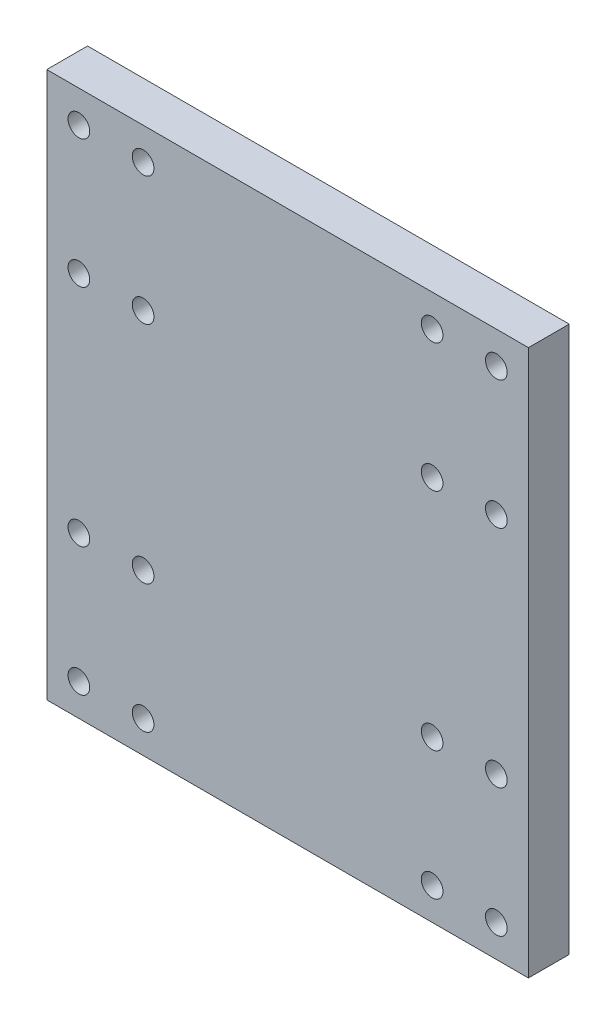
ISO-10303-21;
HEADER;
FILE_DESCRIPTION(('STEP AP214'),'2;1');
FILE_NAME('part.step','',(''),(''),'','','');
FILE_SCHEMA(('AUTOMOTIVE_DESIGN { 1 0 10303 214 1 1 1 1 }'));
ENDSEC;
DATA;
#1=APPLICATION_CONTEXT('core data for automotive mechanical design processes');
#2=APPLICATION_PROTOCOL_DEFINITION('international standard','automotive_design',2000,#1);
#3=PRODUCT_CONTEXT('',#1,'mechanical');
#4=PRODUCT('Part','Part','',(#3));
#5=PRODUCT_RELATED_PRODUCT_CATEGORY('part','',(#4));
#6=PRODUCT_DEFINITION_FORMATION('','',#4);
#7=PRODUCT_DEFINITION_CONTEXT('part definition',#1,'design');
#8=PRODUCT_DEFINITION('design','',#6,#7);
#9=PRODUCT_DEFINITION_SHAPE('','',#8);
#10=(LENGTH_UNIT() NAMED_UNIT(*) SI_UNIT(.MILLI.,.METRE.));
#11=(NAMED_UNIT(*) PLANE_ANGLE_UNIT() SI_UNIT($,.RADIAN.));
#12=(NAMED_UNIT(*) SI_UNIT($,.STERADIAN.) SOLID_ANGLE_UNIT());
#13=UNCERTAINTY_MEASURE_WITH_UNIT(LENGTH_MEASURE(1.E-05),#10,'distance_accuracy_value','');
#14=(GEOMETRIC_REPRESENTATION_CONTEXT(3) GLOBAL_UNCERTAINTY_ASSIGNED_CONTEXT((#13)) GLOBAL_UNIT_ASSIGNED_CONTEXT((#10,
#11,#12)) REPRESENTATION_CONTEXT('',''));
#15=CARTESIAN_POINT('',(0.,0.,0.));
#16=DIRECTION('',(0.,0.,1.));
#17=DIRECTION('',(1.,0.,0.));
#18=AXIS2_PLACEMENT_3D('',#15,#16,#17);
#19=CARTESIAN_POINT('',(-75.,85.,6.35));
#20=DIRECTION('',(1.,0.,0.));
#21=DIRECTION('',(0.,1.,0.));
#22=AXIS2_PLACEMENT_3D('',#19,#20,#21);
#23=PLANE('',#22);
#24=DIRECTION('',(0.,-1.,0.));
#25=VECTOR('',#24,1.);
#26=CARTESIAN_POINT('',(-75.,85.,-6.35));
#27=LINE('',#26,#25);
#28=CARTESIAN_POINT('',(-75.,85.,-6.35));
#29=VERTEX_POINT('',#28);
#30=CARTESIAN_POINT('',(-75.,-85.,-6.35));
#31=VERTEX_POINT('',#30);
#32=EDGE_CURVE('E95',#29,#31,#27,.T.);
#33=ORIENTED_EDGE('',*,*,#32,.T.);
#34=DIRECTION('',(0.,0.,-1.));
#35=VECTOR('',#34,1.);
#36=CARTESIAN_POINT('',(-75.,-85.,6.35));
#37=LINE('',#36,#35);
#38=CARTESIAN_POINT('',(-75.,-85.,6.35));
#39=VERTEX_POINT('',#38);
#40=EDGE_CURVE('E11',#39,#31,#37,.T.);
#41=ORIENTED_EDGE('',*,*,#40,.F.);
#42=DIRECTION('',(0.,-1.,0.));
#43=VECTOR('',#42,1.);
#44=CARTESIAN_POINT('',(-75.,85.,6.35));
#45=LINE('',#44,#43);
#46=CARTESIAN_POINT('',(-75.,85.,6.35));
#47=VERTEX_POINT('',#46);
#48=EDGE_CURVE('E83',#47,#39,#45,.T.);
#49=ORIENTED_EDGE('',*,*,#48,.F.);
#50=DIRECTION('',(0.,0.,-1.));
#51=VECTOR('',#50,1.);
#52=CARTESIAN_POINT('',(-75.,85.,6.35));
#53=LINE('',#52,#51);
#54=EDGE_CURVE('E91',#47,#29,#53,.T.);
#55=ORIENTED_EDGE('',*,*,#54,.T.);
#56=EDGE_LOOP('',(#33,#41,#49,#55));
#57=FACE_BOUND('',#56,.T.);
#58=ADVANCED_FACE('F32',(#57),#23,.F.);
#59=CARTESIAN_POINT('',(75.,-85.,6.35));
#60=DIRECTION('',(0.,1.,0.));
#61=DIRECTION('',(-1.,0.,0.));
#62=AXIS2_PLACEMENT_3D('',#59,#60,#61);
#63=PLANE('',#62);
#64=DIRECTION('',(1.,0.,0.));
#65=VECTOR('',#64,1.);
#66=CARTESIAN_POINT('',(75.,-85.,-6.35));
#67=LINE('',#66,#65);
#68=CARTESIAN_POINT('',(75.,-85.,-6.35));
#69=VERTEX_POINT('',#68);
#70=EDGE_CURVE('E87',#31,#69,#67,.T.);
#71=ORIENTED_EDGE('',*,*,#70,.T.);
#72=DIRECTION('',(0.,0.,-1.));
#73=VECTOR('',#72,1.);
#74=CARTESIAN_POINT('',(75.,-85.,6.35));
#75=LINE('',#74,#73);
#76=CARTESIAN_POINT('',(75.,-85.,6.35));
#77=VERTEX_POINT('',#76);
#78=EDGE_CURVE('E40',#77,#69,#75,.T.);
#79=ORIENTED_EDGE('',*,*,#78,.F.);
#80=DIRECTION('',(1.,0.,0.));
#81=VECTOR('',#80,1.);
#82=CARTESIAN_POINT('',(75.,-85.,6.35));
#83=LINE('',#82,#81);
#84=EDGE_CURVE('E78',#39,#77,#83,.T.);
#85=ORIENTED_EDGE('',*,*,#84,.F.);
#86=ORIENTED_EDGE('',*,*,#40,.T.);
#87=EDGE_LOOP('',(#71,#79,#85,#86));
#88=FACE_BOUND('',#87,.T.);
#89=ADVANCED_FACE('F86',(#88),#63,.F.);
#90=CARTESIAN_POINT('',(75.,85.,6.35));
#91=DIRECTION('',(-1.,0.,0.));
#92=DIRECTION('',(0.,-1.,0.));
#93=AXIS2_PLACEMENT_3D('',#90,#91,#92);
#94=PLANE('',#93);
#95=DIRECTION('',(0.,1.,0.));
#96=VECTOR('',#95,1.);
#97=CARTESIAN_POINT('',(75.,85.,-6.35));
#98=LINE('',#97,#96);
#99=CARTESIAN_POINT('',(75.,85.,-6.35));
#100=VERTEX_POINT('',#99);
#101=EDGE_CURVE('E65',#69,#100,#98,.T.);
#102=ORIENTED_EDGE('',*,*,#101,.T.);
#103=DIRECTION('',(0.,0.,-1.));
#104=VECTOR('',#103,1.);
#105=CARTESIAN_POINT('',(75.,85.,6.35));
#106=LINE('',#105,#104);
#107=CARTESIAN_POINT('',(75.,85.,6.35));
#108=VERTEX_POINT('',#107);
#109=EDGE_CURVE('E88',#108,#100,#106,.T.);
#110=ORIENTED_EDGE('',*,*,#109,.F.);
#111=DIRECTION('',(0.,1.,0.));
#112=VECTOR('',#111,1.);
#113=CARTESIAN_POINT('',(75.,85.,6.35));
#114=LINE('',#113,#112);
#115=EDGE_CURVE('E81',#77,#108,#114,.T.);
#116=ORIENTED_EDGE('',*,*,#115,.F.);
#117=ORIENTED_EDGE('',*,*,#78,.T.);
#118=EDGE_LOOP('',(#102,#110,#116,#117));
#119=FACE_BOUND('',#118,.T.);
#120=ADVANCED_FACE('F89',(#119),#94,.F.);
#121=CARTESIAN_POINT('',(75.,85.,6.35));
#122=DIRECTION('',(0.,-1.,0.));
#123=DIRECTION('',(0.,0.,-1.));
#124=AXIS2_PLACEMENT_3D('',#121,#122,#123);
#125=PLANE('',#124);
#126=DIRECTION('',(-1.,0.,0.));
#127=VECTOR('',#126,1.);
#128=CARTESIAN_POINT('',(75.,85.,-6.35));
#129=LINE('',#128,#127);
#130=EDGE_CURVE('E71',#100,#29,#129,.T.);
#131=ORIENTED_EDGE('',*,*,#130,.T.);
#132=ORIENTED_EDGE('',*,*,#54,.F.);
#133=DIRECTION('',(-1.,0.,0.));
#134=VECTOR('',#133,1.);
#135=CARTESIAN_POINT('',(75.,85.,6.35));
#136=LINE('',#135,#134);
#137=EDGE_CURVE('E48',#108,#47,#136,.T.);
#138=ORIENTED_EDGE('',*,*,#137,.F.);
#139=ORIENTED_EDGE('',*,*,#109,.T.);
#140=EDGE_LOOP('',(#131,#132,#138,#139));
#141=FACE_BOUND('',#140,.T.);
#142=ADVANCED_FACE('F103',(#141),#125,.F.);
#143=CARTESIAN_POINT('',(0.,0.,6.35));
#144=DIRECTION('',(0.,0.,-1.));
#145=DIRECTION('',(-1.,0.,0.));
#146=AXIS2_PLACEMENT_3D('',#143,#144,#145);
#147=PLANE('',#146);
#148=CARTESIAN_POINT('',(65.,75.,6.35));
#149=DIRECTION('',(0.,0.,1.));
#150=DIRECTION('',(1.,0.,0.));
#151=AXIS2_PLACEMENT_3D('',#148,#149,#150);
#152=CIRCLE('',#151,3.37819999999998);
#153=CARTESIAN_POINT('',(68.3782,75.,6.35));
#154=VERTEX_POINT('',#153);
#155=EDGE_CURVE('E201',#154,#154,#152,.T.);
#156=ORIENTED_EDGE('',*,*,#155,.F.);
#157=EDGE_LOOP('',(#156));
#158=FACE_BOUND('',#157,.T.);
#159=CARTESIAN_POINT('',(65.,35.,6.35));
#160=DIRECTION('',(0.,0.,1.));
#161=DIRECTION('',(1.,0.,0.));
#162=AXIS2_PLACEMENT_3D('',#159,#160,#161);
#163=CIRCLE('',#162,3.37819999999998);
#164=CARTESIAN_POINT('',(68.3782,35.,6.35));
#165=VERTEX_POINT('',#164);
#166=EDGE_CURVE('E195',#165,#165,#163,.T.);
#167=ORIENTED_EDGE('',*,*,#166,.F.);
#168=EDGE_LOOP('',(#167));
#169=FACE_BOUND('',#168,.T.);
#170=CARTESIAN_POINT('',(45.,35.,6.35));
#171=DIRECTION('',(0.,0.,1.));
#172=DIRECTION('',(1.,0.,0.));
#173=AXIS2_PLACEMENT_3D('',#170,#171,#172);
#174=CIRCLE('',#173,3.37819999999998);
#175=CARTESIAN_POINT('',(48.3782,35.,6.35));
#176=VERTEX_POINT('',#175);
#177=EDGE_CURVE('E189',#176,#176,#174,.T.);
#178=ORIENTED_EDGE('',*,*,#177,.F.);
#179=EDGE_LOOP('',(#178));
#180=FACE_BOUND('',#179,.T.);
#181=CARTESIAN_POINT('',(45.,75.,6.35));
#182=DIRECTION('',(0.,0.,1.));
#183=DIRECTION('',(1.,0.,0.));
#184=AXIS2_PLACEMENT_3D('',#181,#182,#183);
#185=CIRCLE('',#184,3.37819999999998);
#186=CARTESIAN_POINT('',(48.3782,75.,6.35));
#187=VERTEX_POINT('',#186);
#188=EDGE_CURVE('E183',#187,#187,#185,.T.);
#189=ORIENTED_EDGE('',*,*,#188,.F.);
#190=EDGE_LOOP('',(#189));
#191=FACE_BOUND('',#190,.T.);
#192=CARTESIAN_POINT('',(45.,-75.,6.35));
#193=DIRECTION('',(0.,0.,1.));
#194=DIRECTION('',(1.,0.,0.));
#195=AXIS2_PLACEMENT_3D('',#192,#193,#194);
#196=CIRCLE('',#195,3.37819999999998);
#197=CARTESIAN_POINT('',(48.3782,-75.,6.35));
#198=VERTEX_POINT('',#197);
#199=EDGE_CURVE('E177',#198,#198,#196,.T.);
#200=ORIENTED_EDGE('',*,*,#199,.F.);
#201=EDGE_LOOP('',(#200));
#202=FACE_BOUND('',#201,.T.);
#203=CARTESIAN_POINT('',(45.,-35.,6.35));
#204=DIRECTION('',(0.,0.,1.));
#205=DIRECTION('',(1.,0.,0.));
#206=AXIS2_PLACEMENT_3D('',#203,#204,#205);
#207=CIRCLE('',#206,3.37819999999998);
#208=CARTESIAN_POINT('',(48.3782,-35.,6.35));
#209=VERTEX_POINT('',#208);
#210=EDGE_CURVE('E171',#209,#209,#207,.T.);
#211=ORIENTED_EDGE('',*,*,#210,.F.);
#212=EDGE_LOOP('',(#211));
#213=FACE_BOUND('',#212,.T.);
#214=CARTESIAN_POINT('',(65.,-35.,6.35));
#215=DIRECTION('',(0.,0.,1.));
#216=DIRECTION('',(1.,0.,0.));
#217=AXIS2_PLACEMENT_3D('',#214,#215,#216);
#218=CIRCLE('',#217,3.37819999999998);
#219=CARTESIAN_POINT('',(68.3782,-35.,6.35));
#220=VERTEX_POINT('',#219);
#221=EDGE_CURVE('E165',#220,#220,#218,.T.);
#222=ORIENTED_EDGE('',*,*,#221,.F.);
#223=EDGE_LOOP('',(#222));
#224=FACE_BOUND('',#223,.T.);
#225=CARTESIAN_POINT('',(65.,-75.,6.35));
#226=DIRECTION('',(0.,0.,1.));
#227=DIRECTION('',(1.,0.,0.));
#228=AXIS2_PLACEMENT_3D('',#225,#226,#227);
#229=CIRCLE('',#228,3.37819999999998);
#230=CARTESIAN_POINT('',(68.3782,-75.,6.35));
#231=VERTEX_POINT('',#230);
#232=EDGE_CURVE('E159',#231,#231,#229,.T.);
#233=ORIENTED_EDGE('',*,*,#232,.F.);
#234=EDGE_LOOP('',(#233));
#235=FACE_BOUND('',#234,.T.);
#236=CARTESIAN_POINT('',(-65.,-75.,6.35));
#237=DIRECTION('',(0.,0.,1.));
#238=DIRECTION('',(1.,0.,0.));
#239=AXIS2_PLACEMENT_3D('',#236,#237,#238);
#240=CIRCLE('',#239,3.37819999999998);
#241=CARTESIAN_POINT('',(-61.6218,-75.,6.35));
#242=VERTEX_POINT('',#241);
#243=EDGE_CURVE('E153',#242,#242,#240,.T.);
#244=ORIENTED_EDGE('',*,*,#243,.F.);
#245=EDGE_LOOP('',(#244));
#246=FACE_BOUND('',#245,.T.);
#247=CARTESIAN_POINT('',(-65.,-35.,6.35));
#248=DIRECTION('',(0.,0.,1.));
#249=DIRECTION('',(1.,0.,0.));
#250=AXIS2_PLACEMENT_3D('',#247,#248,#249);
#251=CIRCLE('',#250,3.37819999999998);
#252=CARTESIAN_POINT('',(-61.6218,-35.,6.35));
#253=VERTEX_POINT('',#252);
#254=EDGE_CURVE('E147',#253,#253,#251,.T.);
#255=ORIENTED_EDGE('',*,*,#254,.F.);
#256=EDGE_LOOP('',(#255));
#257=FACE_BOUND('',#256,.T.);
#258=CARTESIAN_POINT('',(-45.,-35.,6.35));
#259=DIRECTION('',(0.,0.,1.));
#260=DIRECTION('',(1.,0.,0.));
#261=AXIS2_PLACEMENT_3D('',#258,#259,#260);
#262=CIRCLE('',#261,3.37819999999998);
#263=CARTESIAN_POINT('',(-41.6218,-35.,6.35));
#264=VERTEX_POINT('',#263);
#265=EDGE_CURVE('E141',#264,#264,#262,.T.);
#266=ORIENTED_EDGE('',*,*,#265,.F.);
#267=EDGE_LOOP('',(#266));
#268=FACE_BOUND('',#267,.T.);
#269=CARTESIAN_POINT('',(-45.,-75.,6.35));
#270=DIRECTION('',(0.,0.,1.));
#271=DIRECTION('',(1.,0.,0.));
#272=AXIS2_PLACEMENT_3D('',#269,#270,#271);
#273=CIRCLE('',#272,3.37819999999998);
#274=CARTESIAN_POINT('',(-41.6218,-75.,6.35));
#275=VERTEX_POINT('',#274);
#276=EDGE_CURVE('E135',#275,#275,#273,.T.);
#277=ORIENTED_EDGE('',*,*,#276,.F.);
#278=EDGE_LOOP('',(#277));
#279=FACE_BOUND('',#278,.T.);
#280=CARTESIAN_POINT('',(-45.,75.,6.35));
#281=DIRECTION('',(0.,0.,1.));
#282=DIRECTION('',(1.,0.,0.));
#283=AXIS2_PLACEMENT_3D('',#280,#281,#282);
#284=CIRCLE('',#283,3.37819999999998);
#285=CARTESIAN_POINT('',(-41.6218,75.,6.35));
#286=VERTEX_POINT('',#285);
#287=EDGE_CURVE('E129',#286,#286,#284,.T.);
#288=ORIENTED_EDGE('',*,*,#287,.F.);
#289=EDGE_LOOP('',(#288));
#290=FACE_BOUND('',#289,.T.);
#291=CARTESIAN_POINT('',(-45.,35.,6.35));
#292=DIRECTION('',(0.,0.,1.));
#293=DIRECTION('',(1.,0.,0.));
#294=AXIS2_PLACEMENT_3D('',#291,#292,#293);
#295=CIRCLE('',#294,3.37819999999998);
#296=CARTESIAN_POINT('',(-41.6218,35.,6.35));
#297=VERTEX_POINT('',#296);
#298=EDGE_CURVE('E123',#297,#297,#295,.T.);
#299=ORIENTED_EDGE('',*,*,#298,.F.);
#300=EDGE_LOOP('',(#299));
#301=FACE_BOUND('',#300,.T.);
#302=CARTESIAN_POINT('',(-65.,35.,6.35));
#303=DIRECTION('',(0.,0.,1.));
#304=DIRECTION('',(1.,0.,0.));
#305=AXIS2_PLACEMENT_3D('',#302,#303,#304);
#306=CIRCLE('',#305,3.37819999999998);
#307=CARTESIAN_POINT('',(-61.6218,35.,6.35));
#308=VERTEX_POINT('',#307);
#309=EDGE_CURVE('E117',#308,#308,#306,.T.);
#310=ORIENTED_EDGE('',*,*,#309,.F.);
#311=EDGE_LOOP('',(#310));
#312=FACE_BOUND('',#311,.T.);
#313=CARTESIAN_POINT('',(-65.,75.,6.35));
#314=DIRECTION('',(0.,0.,1.));
#315=DIRECTION('',(1.,0.,0.));
#316=AXIS2_PLACEMENT_3D('',#313,#314,#315);
#317=CIRCLE('',#316,3.37819999999998);
#318=CARTESIAN_POINT('',(-61.6218,75.,6.35));
#319=VERTEX_POINT('',#318);
#320=EDGE_CURVE('E111',#319,#319,#317,.T.);
#321=ORIENTED_EDGE('',*,*,#320,.F.);
#322=EDGE_LOOP('',(#321));
#323=FACE_BOUND('',#322,.T.);
#324=ORIENTED_EDGE('',*,*,#48,.T.);
#325=ORIENTED_EDGE('',*,*,#84,.T.);
#326=ORIENTED_EDGE('',*,*,#115,.T.);
#327=ORIENTED_EDGE('',*,*,#137,.T.);
#328=EDGE_LOOP('',(#324,#325,#326,#327));
#329=FACE_BOUND('',#328,.T.);
#330=ADVANCED_FACE('F79',(#158,#169,#180,#191,#202,#213,#224,#235,#246,#257,#268,#279,#290,#301,
#312,#323,#329),#147,.F.);
#331=CARTESIAN_POINT('',(0.,0.,-6.35));
#332=DIRECTION('',(0.,0.,-1.));
#333=DIRECTION('',(-1.,0.,0.));
#334=AXIS2_PLACEMENT_3D('',#331,#332,#333);
#335=PLANE('',#334);
#336=CARTESIAN_POINT('',(65.,75.,-6.35));
#337=DIRECTION('',(0.,0.,1.));
#338=DIRECTION('',(1.,0.,0.));
#339=AXIS2_PLACEMENT_3D('',#336,#337,#338);
#340=CIRCLE('',#339,3.3782);
#341=CARTESIAN_POINT('',(68.3782,75.,-6.35));
#342=VERTEX_POINT('',#341);
#343=EDGE_CURVE('E198',#342,#342,#340,.T.);
#344=ORIENTED_EDGE('',*,*,#343,.T.);
#345=EDGE_LOOP('',(#344));
#346=FACE_BOUND('',#345,.T.);
#347=CARTESIAN_POINT('',(65.,35.,-6.35));
#348=DIRECTION('',(0.,0.,1.));
#349=DIRECTION('',(1.,0.,0.));
#350=AXIS2_PLACEMENT_3D('',#347,#348,#349);
#351=CIRCLE('',#350,3.3782);
#352=CARTESIAN_POINT('',(68.3782,35.,-6.35));
#353=VERTEX_POINT('',#352);
#354=EDGE_CURVE('E192',#353,#353,#351,.T.);
#355=ORIENTED_EDGE('',*,*,#354,.T.);
#356=EDGE_LOOP('',(#355));
#357=FACE_BOUND('',#356,.T.);
#358=CARTESIAN_POINT('',(45.,35.,-6.35));
#359=DIRECTION('',(0.,0.,1.));
#360=DIRECTION('',(1.,0.,0.));
#361=AXIS2_PLACEMENT_3D('',#358,#359,#360);
#362=CIRCLE('',#361,3.3782);
#363=CARTESIAN_POINT('',(48.3782,35.,-6.35));
#364=VERTEX_POINT('',#363);
#365=EDGE_CURVE('E186',#364,#364,#362,.T.);
#366=ORIENTED_EDGE('',*,*,#365,.T.);
#367=EDGE_LOOP('',(#366));
#368=FACE_BOUND('',#367,.T.);
#369=CARTESIAN_POINT('',(45.,75.,-6.35));
#370=DIRECTION('',(0.,0.,1.));
#371=DIRECTION('',(1.,0.,0.));
#372=AXIS2_PLACEMENT_3D('',#369,#370,#371);
#373=CIRCLE('',#372,3.3782);
#374=CARTESIAN_POINT('',(48.3782,75.,-6.35));
#375=VERTEX_POINT('',#374);
#376=EDGE_CURVE('E180',#375,#375,#373,.T.);
#377=ORIENTED_EDGE('',*,*,#376,.T.);
#378=EDGE_LOOP('',(#377));
#379=FACE_BOUND('',#378,.T.);
#380=CARTESIAN_POINT('',(45.,-75.,-6.35));
#381=DIRECTION('',(0.,0.,1.));
#382=DIRECTION('',(1.,0.,0.));
#383=AXIS2_PLACEMENT_3D('',#380,#381,#382);
#384=CIRCLE('',#383,3.3782);
#385=CARTESIAN_POINT('',(48.3782,-75.,-6.35));
#386=VERTEX_POINT('',#385);
#387=EDGE_CURVE('E174',#386,#386,#384,.T.);
#388=ORIENTED_EDGE('',*,*,#387,.T.);
#389=EDGE_LOOP('',(#388));
#390=FACE_BOUND('',#389,.T.);
#391=CARTESIAN_POINT('',(45.,-35.,-6.35));
#392=DIRECTION('',(0.,0.,1.));
#393=DIRECTION('',(1.,0.,0.));
#394=AXIS2_PLACEMENT_3D('',#391,#392,#393);
#395=CIRCLE('',#394,3.3782);
#396=CARTESIAN_POINT('',(48.3782,-35.,-6.35));
#397=VERTEX_POINT('',#396);
#398=EDGE_CURVE('E168',#397,#397,#395,.T.);
#399=ORIENTED_EDGE('',*,*,#398,.T.);
#400=EDGE_LOOP('',(#399));
#401=FACE_BOUND('',#400,.T.);
#402=CARTESIAN_POINT('',(65.,-35.,-6.35));
#403=DIRECTION('',(0.,0.,1.));
#404=DIRECTION('',(1.,0.,0.));
#405=AXIS2_PLACEMENT_3D('',#402,#403,#404);
#406=CIRCLE('',#405,3.3782);
#407=CARTESIAN_POINT('',(68.3782,-35.,-6.35));
#408=VERTEX_POINT('',#407);
#409=EDGE_CURVE('E162',#408,#408,#406,.T.);
#410=ORIENTED_EDGE('',*,*,#409,.T.);
#411=EDGE_LOOP('',(#410));
#412=FACE_BOUND('',#411,.T.);
#413=CARTESIAN_POINT('',(65.,-75.,-6.35));
#414=DIRECTION('',(0.,0.,1.));
#415=DIRECTION('',(1.,0.,0.));
#416=AXIS2_PLACEMENT_3D('',#413,#414,#415);
#417=CIRCLE('',#416,3.3782);
#418=CARTESIAN_POINT('',(68.3782,-75.,-6.35));
#419=VERTEX_POINT('',#418);
#420=EDGE_CURVE('E156',#419,#419,#417,.T.);
#421=ORIENTED_EDGE('',*,*,#420,.T.);
#422=EDGE_LOOP('',(#421));
#423=FACE_BOUND('',#422,.T.);
#424=CARTESIAN_POINT('',(-65.,-75.,-6.35));
#425=DIRECTION('',(0.,0.,1.));
#426=DIRECTION('',(1.,0.,0.));
#427=AXIS2_PLACEMENT_3D('',#424,#425,#426);
#428=CIRCLE('',#427,3.3782);
#429=CARTESIAN_POINT('',(-61.6218,-75.,-6.35));
#430=VERTEX_POINT('',#429);
#431=EDGE_CURVE('E150',#430,#430,#428,.T.);
#432=ORIENTED_EDGE('',*,*,#431,.T.);
#433=EDGE_LOOP('',(#432));
#434=FACE_BOUND('',#433,.T.);
#435=CARTESIAN_POINT('',(-65.,-35.,-6.35));
#436=DIRECTION('',(0.,0.,1.));
#437=DIRECTION('',(1.,0.,0.));
#438=AXIS2_PLACEMENT_3D('',#435,#436,#437);
#439=CIRCLE('',#438,3.3782);
#440=CARTESIAN_POINT('',(-61.6218,-35.,-6.35));
#441=VERTEX_POINT('',#440);
#442=EDGE_CURVE('E144',#441,#441,#439,.T.);
#443=ORIENTED_EDGE('',*,*,#442,.T.);
#444=EDGE_LOOP('',(#443));
#445=FACE_BOUND('',#444,.T.);
#446=CARTESIAN_POINT('',(-45.,-35.,-6.35));
#447=DIRECTION('',(0.,0.,1.));
#448=DIRECTION('',(1.,0.,0.));
#449=AXIS2_PLACEMENT_3D('',#446,#447,#448);
#450=CIRCLE('',#449,3.3782);
#451=CARTESIAN_POINT('',(-41.6218,-35.,-6.35));
#452=VERTEX_POINT('',#451);
#453=EDGE_CURVE('E138',#452,#452,#450,.T.);
#454=ORIENTED_EDGE('',*,*,#453,.T.);
#455=EDGE_LOOP('',(#454));
#456=FACE_BOUND('',#455,.T.);
#457=CARTESIAN_POINT('',(-45.,-75.,-6.35));
#458=DIRECTION('',(0.,0.,1.));
#459=DIRECTION('',(1.,0.,0.));
#460=AXIS2_PLACEMENT_3D('',#457,#458,#459);
#461=CIRCLE('',#460,3.3782);
#462=CARTESIAN_POINT('',(-41.6218,-75.,-6.35));
#463=VERTEX_POINT('',#462);
#464=EDGE_CURVE('E132',#463,#463,#461,.T.);
#465=ORIENTED_EDGE('',*,*,#464,.T.);
#466=EDGE_LOOP('',(#465));
#467=FACE_BOUND('',#466,.T.);
#468=CARTESIAN_POINT('',(-45.,75.,-6.35));
#469=DIRECTION('',(0.,0.,1.));
#470=DIRECTION('',(1.,0.,0.));
#471=AXIS2_PLACEMENT_3D('',#468,#469,#470);
#472=CIRCLE('',#471,3.3782);
#473=CARTESIAN_POINT('',(-41.6218,75.,-6.35));
#474=VERTEX_POINT('',#473);
#475=EDGE_CURVE('E126',#474,#474,#472,.T.);
#476=ORIENTED_EDGE('',*,*,#475,.T.);
#477=EDGE_LOOP('',(#476));
#478=FACE_BOUND('',#477,.T.);
#479=CARTESIAN_POINT('',(-45.,35.,-6.35));
#480=DIRECTION('',(0.,0.,1.));
#481=DIRECTION('',(1.,0.,0.));
#482=AXIS2_PLACEMENT_3D('',#479,#480,#481);
#483=CIRCLE('',#482,3.3782);
#484=CARTESIAN_POINT('',(-41.6218,35.,-6.35));
#485=VERTEX_POINT('',#484);
#486=EDGE_CURVE('E120',#485,#485,#483,.T.);
#487=ORIENTED_EDGE('',*,*,#486,.T.);
#488=EDGE_LOOP('',(#487));
#489=FACE_BOUND('',#488,.T.);
#490=CARTESIAN_POINT('',(-65.,35.,-6.35));
#491=DIRECTION('',(0.,0.,1.));
#492=DIRECTION('',(1.,0.,0.));
#493=AXIS2_PLACEMENT_3D('',#490,#491,#492);
#494=CIRCLE('',#493,3.3782);
#495=CARTESIAN_POINT('',(-61.6218,35.,-6.35));
#496=VERTEX_POINT('',#495);
#497=EDGE_CURVE('E114',#496,#496,#494,.T.);
#498=ORIENTED_EDGE('',*,*,#497,.T.);
#499=EDGE_LOOP('',(#498));
#500=FACE_BOUND('',#499,.T.);
#501=CARTESIAN_POINT('',(-65.,75.,-6.35));
#502=DIRECTION('',(0.,0.,1.));
#503=DIRECTION('',(1.,0.,0.));
#504=AXIS2_PLACEMENT_3D('',#501,#502,#503);
#505=CIRCLE('',#504,3.3782);
#506=CARTESIAN_POINT('',(-61.6218,75.,-6.35));
#507=VERTEX_POINT('',#506);
#508=EDGE_CURVE('E98',#507,#507,#505,.T.);
#509=ORIENTED_EDGE('',*,*,#508,.T.);
#510=EDGE_LOOP('',(#509));
#511=FACE_BOUND('',#510,.T.);
#512=ORIENTED_EDGE('',*,*,#32,.F.);
#513=ORIENTED_EDGE('',*,*,#130,.F.);
#514=ORIENTED_EDGE('',*,*,#101,.F.);
#515=ORIENTED_EDGE('',*,*,#70,.F.);
#516=EDGE_LOOP('',(#512,#513,#514,#515));
#517=FACE_BOUND('',#516,.T.);
#518=ADVANCED_FACE('F106',(#346,#357,#368,#379,#390,#401,#412,#423,#434,#445,#456,#467,#478,
#489,#500,#511,#517),#335,.T.);
#519=CARTESIAN_POINT('',(-65.,75.,6.35));
#520=DIRECTION('',(0.,0.,1.));
#521=DIRECTION('',(1.,0.,0.));
#522=AXIS2_PLACEMENT_3D('',#519,#520,#521);
#523=CYLINDRICAL_SURFACE('',#522,3.37819999999999);
#524=ORIENTED_EDGE('',*,*,#508,.F.);
#525=EDGE_LOOP('',(#524));
#526=FACE_BOUND('',#525,.T.);
#527=ORIENTED_EDGE('',*,*,#320,.T.);
#528=EDGE_LOOP('',(#527));
#529=FACE_BOUND('',#528,.T.);
#530=ADVANCED_FACE('F240',(#526,#529),#523,.F.);
#531=CARTESIAN_POINT('',(-65.,35.,6.35));
#532=DIRECTION('',(0.,0.,1.));
#533=DIRECTION('',(1.,0.,0.));
#534=AXIS2_PLACEMENT_3D('',#531,#532,#533);
#535=CYLINDRICAL_SURFACE('',#534,3.37819999999999);
#536=ORIENTED_EDGE('',*,*,#497,.F.);
#537=EDGE_LOOP('',(#536));
#538=FACE_BOUND('',#537,.T.);
#539=ORIENTED_EDGE('',*,*,#309,.T.);
#540=EDGE_LOOP('',(#539));
#541=FACE_BOUND('',#540,.T.);
#542=ADVANCED_FACE('F242',(#538,#541),#535,.F.);
#543=CARTESIAN_POINT('',(-45.,35.,6.35));
#544=DIRECTION('',(0.,0.,1.));
#545=DIRECTION('',(1.,0.,0.));
#546=AXIS2_PLACEMENT_3D('',#543,#544,#545);
#547=CYLINDRICAL_SURFACE('',#546,3.37819999999999);
#548=ORIENTED_EDGE('',*,*,#486,.F.);
#549=EDGE_LOOP('',(#548));
#550=FACE_BOUND('',#549,.T.);
#551=ORIENTED_EDGE('',*,*,#298,.T.);
#552=EDGE_LOOP('',(#551));
#553=FACE_BOUND('',#552,.T.);
#554=ADVANCED_FACE('F249',(#550,#553),#547,.F.);
#555=CARTESIAN_POINT('',(-45.,75.,6.35));
#556=DIRECTION('',(0.,0.,1.));
#557=DIRECTION('',(1.,0.,0.));
#558=AXIS2_PLACEMENT_3D('',#555,#556,#557);
#559=CYLINDRICAL_SURFACE('',#558,3.37819999999999);
#560=ORIENTED_EDGE('',*,*,#475,.F.);
#561=EDGE_LOOP('',(#560));
#562=FACE_BOUND('',#561,.T.);
#563=ORIENTED_EDGE('',*,*,#287,.T.);
#564=EDGE_LOOP('',(#563));
#565=FACE_BOUND('',#564,.T.);
#566=ADVANCED_FACE('F296',(#562,#565),#559,.F.);
#567=CARTESIAN_POINT('',(-45.,-75.,6.35));
#568=DIRECTION('',(0.,0.,1.));
#569=DIRECTION('',(1.,0.,0.));
#570=AXIS2_PLACEMENT_3D('',#567,#568,#569);
#571=CYLINDRICAL_SURFACE('',#570,3.37819999999999);
#572=ORIENTED_EDGE('',*,*,#464,.F.);
#573=EDGE_LOOP('',(#572));
#574=FACE_BOUND('',#573,.T.);
#575=ORIENTED_EDGE('',*,*,#276,.T.);
#576=EDGE_LOOP('',(#575));
#577=FACE_BOUND('',#576,.T.);
#578=ADVANCED_FACE('F306',(#574,#577),#571,.F.);
#579=CARTESIAN_POINT('',(-45.,-35.,6.35));
#580=DIRECTION('',(0.,0.,1.));
#581=DIRECTION('',(1.,0.,0.));
#582=AXIS2_PLACEMENT_3D('',#579,#580,#581);
#583=CYLINDRICAL_SURFACE('',#582,3.37819999999999);
#584=ORIENTED_EDGE('',*,*,#453,.F.);
#585=EDGE_LOOP('',(#584));
#586=FACE_BOUND('',#585,.T.);
#587=ORIENTED_EDGE('',*,*,#265,.T.);
#588=EDGE_LOOP('',(#587));
#589=FACE_BOUND('',#588,.T.);
#590=ADVANCED_FACE('F316',(#586,#589),#583,.F.);
#591=CARTESIAN_POINT('',(-65.,-35.,6.35));
#592=DIRECTION('',(0.,0.,1.));
#593=DIRECTION('',(1.,0.,0.));
#594=AXIS2_PLACEMENT_3D('',#591,#592,#593);
#595=CYLINDRICAL_SURFACE('',#594,3.37819999999999);
#596=ORIENTED_EDGE('',*,*,#442,.F.);
#597=EDGE_LOOP('',(#596));
#598=FACE_BOUND('',#597,.T.);
#599=ORIENTED_EDGE('',*,*,#254,.T.);
#600=EDGE_LOOP('',(#599));
#601=FACE_BOUND('',#600,.T.);
#602=ADVANCED_FACE('F326',(#598,#601),#595,.F.);
#603=CARTESIAN_POINT('',(-65.,-75.,6.35));
#604=DIRECTION('',(0.,0.,1.));
#605=DIRECTION('',(1.,0.,0.));
#606=AXIS2_PLACEMENT_3D('',#603,#604,#605);
#607=CYLINDRICAL_SURFACE('',#606,3.37819999999999);
#608=ORIENTED_EDGE('',*,*,#431,.F.);
#609=EDGE_LOOP('',(#608));
#610=FACE_BOUND('',#609,.T.);
#611=ORIENTED_EDGE('',*,*,#243,.T.);
#612=EDGE_LOOP('',(#611));
#613=FACE_BOUND('',#612,.T.);
#614=ADVANCED_FACE('F336',(#610,#613),#607,.F.);
#615=CARTESIAN_POINT('',(65.,-75.,6.35));
#616=DIRECTION('',(0.,0.,1.));
#617=DIRECTION('',(1.,0.,0.));
#618=AXIS2_PLACEMENT_3D('',#615,#616,#617);
#619=CYLINDRICAL_SURFACE('',#618,3.37819999999999);
#620=ORIENTED_EDGE('',*,*,#420,.F.);
#621=EDGE_LOOP('',(#620));
#622=FACE_BOUND('',#621,.T.);
#623=ORIENTED_EDGE('',*,*,#232,.T.);
#624=EDGE_LOOP('',(#623));
#625=FACE_BOUND('',#624,.T.);
#626=ADVANCED_FACE('F346',(#622,#625),#619,.F.);
#627=CARTESIAN_POINT('',(65.,-35.,6.35));
#628=DIRECTION('',(0.,0.,1.));
#629=DIRECTION('',(1.,0.,0.));
#630=AXIS2_PLACEMENT_3D('',#627,#628,#629);
#631=CYLINDRICAL_SURFACE('',#630,3.37819999999999);
#632=ORIENTED_EDGE('',*,*,#409,.F.);
#633=EDGE_LOOP('',(#632));
#634=FACE_BOUND('',#633,.T.);
#635=ORIENTED_EDGE('',*,*,#221,.T.);
#636=EDGE_LOOP('',(#635));
#637=FACE_BOUND('',#636,.T.);
#638=ADVANCED_FACE('F356',(#634,#637),#631,.F.);
#639=CARTESIAN_POINT('',(45.,-35.,6.35));
#640=DIRECTION('',(0.,0.,1.));
#641=DIRECTION('',(1.,0.,0.));
#642=AXIS2_PLACEMENT_3D('',#639,#640,#641);
#643=CYLINDRICAL_SURFACE('',#642,3.37819999999999);
#644=ORIENTED_EDGE('',*,*,#398,.F.);
#645=EDGE_LOOP('',(#644));
#646=FACE_BOUND('',#645,.T.);
#647=ORIENTED_EDGE('',*,*,#210,.T.);
#648=EDGE_LOOP('',(#647));
#649=FACE_BOUND('',#648,.T.);
#650=ADVANCED_FACE('F366',(#646,#649),#643,.F.);
#651=CARTESIAN_POINT('',(45.,-75.,6.35));
#652=DIRECTION('',(0.,0.,1.));
#653=DIRECTION('',(1.,0.,0.));
#654=AXIS2_PLACEMENT_3D('',#651,#652,#653);
#655=CYLINDRICAL_SURFACE('',#654,3.37819999999999);
#656=ORIENTED_EDGE('',*,*,#387,.F.);
#657=EDGE_LOOP('',(#656));
#658=FACE_BOUND('',#657,.T.);
#659=ORIENTED_EDGE('',*,*,#199,.T.);
#660=EDGE_LOOP('',(#659));
#661=FACE_BOUND('',#660,.T.);
#662=ADVANCED_FACE('F376',(#658,#661),#655,.F.);
#663=CARTESIAN_POINT('',(45.,75.,6.35));
#664=DIRECTION('',(0.,0.,1.));
#665=DIRECTION('',(1.,0.,0.));
#666=AXIS2_PLACEMENT_3D('',#663,#664,#665);
#667=CYLINDRICAL_SURFACE('',#666,3.37819999999999);
#668=ORIENTED_EDGE('',*,*,#376,.F.);
#669=EDGE_LOOP('',(#668));
#670=FACE_BOUND('',#669,.T.);
#671=ORIENTED_EDGE('',*,*,#188,.T.);
#672=EDGE_LOOP('',(#671));
#673=FACE_BOUND('',#672,.T.);
#674=ADVANCED_FACE('F386',(#670,#673),#667,.F.);
#675=CARTESIAN_POINT('',(45.,35.,6.35));
#676=DIRECTION('',(0.,0.,1.));
#677=DIRECTION('',(1.,0.,0.));
#678=AXIS2_PLACEMENT_3D('',#675,#676,#677);
#679=CYLINDRICAL_SURFACE('',#678,3.37819999999999);
#680=ORIENTED_EDGE('',*,*,#365,.F.);
#681=EDGE_LOOP('',(#680));
#682=FACE_BOUND('',#681,.T.);
#683=ORIENTED_EDGE('',*,*,#177,.T.);
#684=EDGE_LOOP('',(#683));
#685=FACE_BOUND('',#684,.T.);
#686=ADVANCED_FACE('F396',(#682,#685),#679,.F.);
#687=CARTESIAN_POINT('',(65.,35.,6.35));
#688=DIRECTION('',(0.,0.,1.));
#689=DIRECTION('',(1.,0.,0.));
#690=AXIS2_PLACEMENT_3D('',#687,#688,#689);
#691=CYLINDRICAL_SURFACE('',#690,3.37819999999999);
#692=ORIENTED_EDGE('',*,*,#354,.F.);
#693=EDGE_LOOP('',(#692));
#694=FACE_BOUND('',#693,.T.);
#695=ORIENTED_EDGE('',*,*,#166,.T.);
#696=EDGE_LOOP('',(#695));
#697=FACE_BOUND('',#696,.T.);
#698=ADVANCED_FACE('F406',(#694,#697),#691,.F.);
#699=CARTESIAN_POINT('',(65.,75.,6.35));
#700=DIRECTION('',(0.,0.,1.));
#701=DIRECTION('',(1.,0.,0.));
#702=AXIS2_PLACEMENT_3D('',#699,#700,#701);
#703=CYLINDRICAL_SURFACE('',#702,3.37819999999999);
#704=ORIENTED_EDGE('',*,*,#343,.F.);
#705=EDGE_LOOP('',(#704));
#706=FACE_BOUND('',#705,.T.);
#707=ORIENTED_EDGE('',*,*,#155,.T.);
#708=EDGE_LOOP('',(#707));
#709=FACE_BOUND('',#708,.T.);
#710=ADVANCED_FACE('F205',(#706,#709),#703,.F.);
#711=CLOSED_SHELL('',(#58,#89,#120,#142,#330,#518,#530,#542,#554,#566,#578,#590,#602,#614,#626,
#638,#650,#662,#674,#686,#698,#710));
#712=MANIFOLD_SOLID_BREP('B2',#711);
#713=ADVANCED_BREP_SHAPE_REPRESENTATION('',(#18,#712),#14);
#714=SHAPE_DEFINITION_REPRESENTATION(#9,#713);
ENDSEC;
END-ISO-10303-21;
